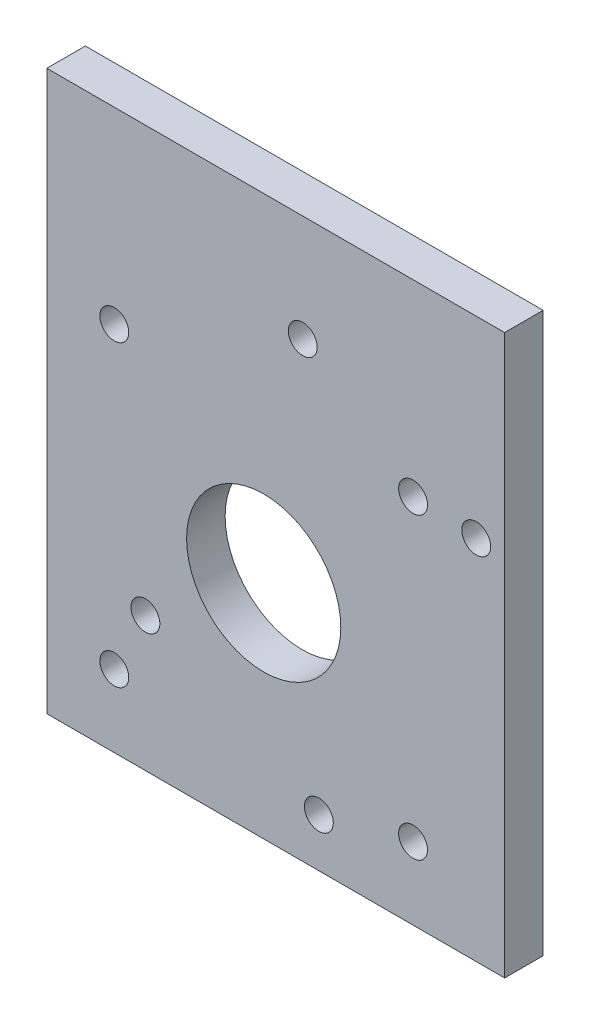
ISO-10303-21;
HEADER;
FILE_DESCRIPTION(('STEP AP214'),'2;1');
FILE_NAME('part.step','',(''),(''),'','','');
FILE_SCHEMA(('AUTOMOTIVE_DESIGN { 1 0 10303 214 1 1 1 1 }'));
ENDSEC;
DATA;
#1=APPLICATION_CONTEXT('core data for automotive mechanical design processes');
#2=APPLICATION_PROTOCOL_DEFINITION('international standard','automotive_design',2000,#1);
#3=PRODUCT_CONTEXT('',#1,'mechanical');
#4=PRODUCT('Part','Part','',(#3));
#5=PRODUCT_RELATED_PRODUCT_CATEGORY('part','',(#4));
#6=PRODUCT_DEFINITION_FORMATION('','',#4);
#7=PRODUCT_DEFINITION_CONTEXT('part definition',#1,'design');
#8=PRODUCT_DEFINITION('design','',#6,#7);
#9=PRODUCT_DEFINITION_SHAPE('','',#8);
#10=(LENGTH_UNIT() NAMED_UNIT(*) SI_UNIT(.MILLI.,.METRE.));
#11=(NAMED_UNIT(*) PLANE_ANGLE_UNIT() SI_UNIT($,.RADIAN.));
#12=(NAMED_UNIT(*) SI_UNIT($,.STERADIAN.) SOLID_ANGLE_UNIT());
#13=UNCERTAINTY_MEASURE_WITH_UNIT(LENGTH_MEASURE(1.E-05),#10,'distance_accuracy_value','');
#14=(GEOMETRIC_REPRESENTATION_CONTEXT(3) GLOBAL_UNCERTAINTY_ASSIGNED_CONTEXT((#13)) GLOBAL_UNIT_ASSIGNED_CONTEXT((#10,
#11,#12)) REPRESENTATION_CONTEXT('',''));
#15=CARTESIAN_POINT('',(0.,0.,0.));
#16=DIRECTION('',(0.,0.,1.));
#17=DIRECTION('',(1.,0.,0.));
#18=AXIS2_PLACEMENT_3D('',#15,#16,#17);
#19=CARTESIAN_POINT('',(-21.25,20.,2.));
#20=DIRECTION('',(1.,0.,0.));
#21=DIRECTION('',(0.,1.,0.));
#22=AXIS2_PLACEMENT_3D('',#19,#20,#21);
#23=PLANE('',#22);
#24=DIRECTION('',(0.,-1.,0.));
#25=VECTOR('',#24,1.);
#26=CARTESIAN_POINT('',(-21.25,20.,-2.));
#27=LINE('',#26,#25);
#28=CARTESIAN_POINT('',(-21.25,35.,-2.));
#29=VERTEX_POINT('',#28);
#30=CARTESIAN_POINT('',(-21.25,-23.,-2.));
#31=VERTEX_POINT('',#30);
#32=EDGE_CURVE('E48',#29,#31,#27,.T.);
#33=ORIENTED_EDGE('',*,*,#32,.T.);
#34=DIRECTION('',(0.,0.,-1.));
#35=VECTOR('',#34,1.);
#36=CARTESIAN_POINT('',(-21.25,-23.,2.));
#37=LINE('',#36,#35);
#38=CARTESIAN_POINT('',(-21.25,-23.,2.));
#39=VERTEX_POINT('',#38);
#40=EDGE_CURVE('E78',#39,#31,#37,.T.);
#41=ORIENTED_EDGE('',*,*,#40,.F.);
#42=DIRECTION('',(0.,-1.,0.));
#43=VECTOR('',#42,1.);
#44=CARTESIAN_POINT('',(-21.25,20.,2.));
#45=LINE('',#44,#43);
#46=CARTESIAN_POINT('',(-21.25,35.,2.));
#47=VERTEX_POINT('',#46);
#48=EDGE_CURVE('E11',#47,#39,#45,.T.);
#49=ORIENTED_EDGE('',*,*,#48,.F.);
#50=DIRECTION('',(0.,0.,1.));
#51=VECTOR('',#50,1.);
#52=CARTESIAN_POINT('',(-21.25,35.,-2.));
#53=LINE('',#52,#51);
#54=EDGE_CURVE('E80',#29,#47,#53,.T.);
#55=ORIENTED_EDGE('',*,*,#54,.F.);
#56=EDGE_LOOP('',(#33,#41,#49,#55));
#57=FACE_BOUND('',#56,.T.);
#58=ADVANCED_FACE('F39',(#57),#23,.F.);
#59=CARTESIAN_POINT('',(0.,0.,2.));
#60=DIRECTION('',(0.,0.,1.));
#61=DIRECTION('',(1.,0.,0.));
#62=AXIS2_PLACEMENT_3D('',#59,#60,#61);
#63=PLANE('',#62);
#64=CARTESIAN_POINT('',(5.30380298188453,23.9455011505475,2.));
#65=DIRECTION('',(0.,0.,1.));
#66=DIRECTION('',(1.,0.,0.));
#67=AXIS2_PLACEMENT_3D('',#64,#65,#66);
#68=CIRCLE('',#67,1.5);
#69=CARTESIAN_POINT('',(6.80380298188453,23.9455011505475,2.));
#70=VERTEX_POINT('',#69);
#71=EDGE_CURVE('E107',#70,#70,#68,.T.);
#72=ORIENTED_EDGE('',*,*,#71,.F.);
#73=EDGE_LOOP('',(#72));
#74=FACE_BOUND('',#73,.T.);
#75=CARTESIAN_POINT('',(23.3034781889665,15.0393082460977,2.));
#76=DIRECTION('',(0.,0.,1.));
#77=DIRECTION('',(1.,0.,0.));
#78=AXIS2_PLACEMENT_3D('',#75,#76,#77);
#79=CIRCLE('',#78,1.5);
#80=CARTESIAN_POINT('',(24.8034781889665,15.0393082460977,2.));
#81=VERTEX_POINT('',#80);
#82=EDGE_CURVE('E112',#81,#81,#79,.T.);
#83=ORIENTED_EDGE('',*,*,#82,.F.);
#84=EDGE_LOOP('',(#83));
#85=FACE_BOUND('',#84,.T.);
#86=CARTESIAN_POINT('',(6.97545786414189,-17.9600963002193,2.));
#87=DIRECTION('',(0.,0.,1.));
#88=DIRECTION('',(1.,0.,0.));
#89=AXIS2_PLACEMENT_3D('',#86,#87,#88);
#90=CIRCLE('',#89,1.5);
#91=CARTESIAN_POINT('',(8.47545786414189,-17.9600963002193,2.));
#92=VERTEX_POINT('',#91);
#93=EDGE_CURVE('E116',#92,#92,#90,.T.);
#94=ORIENTED_EDGE('',*,*,#93,.F.);
#95=EDGE_LOOP('',(#94));
#96=FACE_BOUND('',#95,.T.);
#97=CARTESIAN_POINT('',(-11.0242173429401,-9.05390339576949,2.));
#98=DIRECTION('',(0.,0.,1.));
#99=DIRECTION('',(1.,0.,0.));
#100=AXIS2_PLACEMENT_3D('',#97,#98,#99);
#101=CIRCLE('',#100,1.5);
#102=CARTESIAN_POINT('',(-9.52421734294013,-9.05390339576949,2.));
#103=VERTEX_POINT('',#102);
#104=EDGE_CURVE('E106',#103,#103,#101,.T.);
#105=ORIENTED_EDGE('',*,*,#104,.F.);
#106=EDGE_LOOP('',(#105));
#107=FACE_BOUND('',#106,.T.);
#108=CARTESIAN_POINT('',(1.25,0.,2.));
#109=DIRECTION('',(0.,0.,1.));
#110=DIRECTION('',(1.,0.,0.));
#111=AXIS2_PLACEMENT_3D('',#108,#109,#110);
#112=CIRCLE('',#111,8.);
#113=CARTESIAN_POINT('',(9.25,0.,2.));
#114=VERTEX_POINT('',#113);
#115=EDGE_CURVE('E140',#114,#114,#112,.T.);
#116=ORIENTED_EDGE('',*,*,#115,.F.);
#117=EDGE_LOOP('',(#116));
#118=FACE_BOUND('',#117,.T.);
#119=CARTESIAN_POINT('',(16.75,-15.5,2.));
#120=DIRECTION('',(0.,0.,-1.));
#121=DIRECTION('',(-1.,0.,0.));
#122=AXIS2_PLACEMENT_3D('',#119,#120,#121);
#123=CIRCLE('',#122,1.5);
#124=CARTESIAN_POINT('',(15.25,-15.5,2.));
#125=VERTEX_POINT('',#124);
#126=EDGE_CURVE('E166',#125,#125,#123,.T.);
#127=ORIENTED_EDGE('',*,*,#126,.T.);
#128=EDGE_LOOP('',(#127));
#129=FACE_BOUND('',#128,.T.);
#130=CARTESIAN_POINT('',(-14.25,-15.5,2.));
#131=DIRECTION('',(0.,0.,-1.));
#132=DIRECTION('',(-1.,0.,0.));
#133=AXIS2_PLACEMENT_3D('',#130,#131,#132);
#134=CIRCLE('',#133,1.5);
#135=CARTESIAN_POINT('',(-15.75,-15.5,2.));
#136=VERTEX_POINT('',#135);
#137=EDGE_CURVE('E158',#136,#136,#134,.T.);
#138=ORIENTED_EDGE('',*,*,#137,.T.);
#139=EDGE_LOOP('',(#138));
#140=FACE_BOUND('',#139,.T.);
#141=CARTESIAN_POINT('',(-14.25,15.5,2.));
#142=DIRECTION('',(0.,0.,-1.));
#143=DIRECTION('',(-1.,0.,0.));
#144=AXIS2_PLACEMENT_3D('',#141,#142,#143);
#145=CIRCLE('',#144,1.5);
#146=CARTESIAN_POINT('',(-15.75,15.5,2.));
#147=VERTEX_POINT('',#146);
#148=EDGE_CURVE('E149',#147,#147,#145,.T.);
#149=ORIENTED_EDGE('',*,*,#148,.T.);
#150=EDGE_LOOP('',(#149));
#151=FACE_BOUND('',#150,.T.);
#152=CARTESIAN_POINT('',(16.75,15.5,2.));
#153=DIRECTION('',(0.,0.,-1.));
#154=DIRECTION('',(-1.,0.,0.));
#155=AXIS2_PLACEMENT_3D('',#152,#153,#154);
#156=CIRCLE('',#155,1.5);
#157=CARTESIAN_POINT('',(15.25,15.5,2.));
#158=VERTEX_POINT('',#157);
#159=EDGE_CURVE('E82',#158,#158,#156,.T.);
#160=ORIENTED_EDGE('',*,*,#159,.T.);
#161=EDGE_LOOP('',(#160));
#162=FACE_BOUND('',#161,.T.);
#163=ORIENTED_EDGE('',*,*,#48,.T.);
#164=DIRECTION('',(-1.,0.,0.));
#165=VECTOR('',#164,1.);
#166=CARTESIAN_POINT('',(-21.25,-23.,2.));
#167=LINE('',#166,#165);
#168=CARTESIAN_POINT('',(26.25,-23.,2.));
#169=VERTEX_POINT('',#168);
#170=EDGE_CURVE('E98',#169,#39,#167,.T.);
#171=ORIENTED_EDGE('',*,*,#170,.F.);
#172=DIRECTION('',(0.,-1.,0.));
#173=VECTOR('',#172,1.);
#174=CARTESIAN_POINT('',(26.25,35.,2.));
#175=LINE('',#174,#173);
#176=CARTESIAN_POINT('',(26.25,35.,2.));
#177=VERTEX_POINT('',#176);
#178=EDGE_CURVE('E123',#177,#169,#175,.T.);
#179=ORIENTED_EDGE('',*,*,#178,.F.);
#180=DIRECTION('',(1.,0.,0.));
#181=VECTOR('',#180,1.);
#182=CARTESIAN_POINT('',(-21.25,35.,2.));
#183=LINE('',#182,#181);
#184=EDGE_CURVE('E134',#47,#177,#183,.T.);
#185=ORIENTED_EDGE('',*,*,#184,.F.);
#186=EDGE_LOOP('',(#163,#171,#179,#185));
#187=FACE_BOUND('',#186,.T.);
#188=ADVANCED_FACE('F209',(#74,#85,#96,#107,#118,#129,#140,#151,#162,#187),#63,.T.);
#189=CARTESIAN_POINT('',(0.,0.,-2.));
#190=DIRECTION('',(0.,0.,1.));
#191=DIRECTION('',(1.,0.,0.));
#192=AXIS2_PLACEMENT_3D('',#189,#190,#191);
#193=PLANE('',#192);
#194=CARTESIAN_POINT('',(5.30380298188453,23.9455011505475,-2.));
#195=DIRECTION('',(0.,0.,1.));
#196=DIRECTION('',(1.,0.,0.));
#197=AXIS2_PLACEMENT_3D('',#194,#195,#196);
#198=CIRCLE('',#197,1.5);
#199=CARTESIAN_POINT('',(6.80380298188453,23.9455011505475,-2.));
#200=VERTEX_POINT('',#199);
#201=EDGE_CURVE('E42',#200,#200,#198,.T.);
#202=ORIENTED_EDGE('',*,*,#201,.T.);
#203=EDGE_LOOP('',(#202));
#204=FACE_BOUND('',#203,.T.);
#205=CARTESIAN_POINT('',(23.3034781889665,15.0393082460977,-2.));
#206=DIRECTION('',(0.,0.,1.));
#207=DIRECTION('',(1.,0.,0.));
#208=AXIS2_PLACEMENT_3D('',#205,#206,#207);
#209=CIRCLE('',#208,1.5);
#210=CARTESIAN_POINT('',(24.8034781889665,15.0393082460977,-2.));
#211=VERTEX_POINT('',#210);
#212=EDGE_CURVE('E185',#211,#211,#209,.T.);
#213=ORIENTED_EDGE('',*,*,#212,.T.);
#214=EDGE_LOOP('',(#213));
#215=FACE_BOUND('',#214,.T.);
#216=CARTESIAN_POINT('',(6.97545786414189,-17.9600963002193,-2.));
#217=DIRECTION('',(0.,0.,1.));
#218=DIRECTION('',(1.,0.,0.));
#219=AXIS2_PLACEMENT_3D('',#216,#217,#218);
#220=CIRCLE('',#219,1.5);
#221=CARTESIAN_POINT('',(8.47545786414189,-17.9600963002193,-2.));
#222=VERTEX_POINT('',#221);
#223=EDGE_CURVE('E182',#222,#222,#220,.T.);
#224=ORIENTED_EDGE('',*,*,#223,.T.);
#225=EDGE_LOOP('',(#224));
#226=FACE_BOUND('',#225,.T.);
#227=CARTESIAN_POINT('',(-11.0242173429401,-9.05390339576949,-2.));
#228=DIRECTION('',(0.,0.,1.));
#229=DIRECTION('',(1.,0.,0.));
#230=AXIS2_PLACEMENT_3D('',#227,#228,#229);
#231=CIRCLE('',#230,1.5);
#232=CARTESIAN_POINT('',(-9.52421734294013,-9.05390339576949,-2.));
#233=VERTEX_POINT('',#232);
#234=EDGE_CURVE('E111',#233,#233,#231,.T.);
#235=ORIENTED_EDGE('',*,*,#234,.T.);
#236=EDGE_LOOP('',(#235));
#237=FACE_BOUND('',#236,.T.);
#238=CARTESIAN_POINT('',(1.25,0.,-2.));
#239=DIRECTION('',(0.,0.,1.));
#240=DIRECTION('',(1.,0.,0.));
#241=AXIS2_PLACEMENT_3D('',#238,#239,#240);
#242=CIRCLE('',#241,8.);
#243=CARTESIAN_POINT('',(9.25,0.,-2.));
#244=VERTEX_POINT('',#243);
#245=EDGE_CURVE('E141',#244,#244,#242,.T.);
#246=ORIENTED_EDGE('',*,*,#245,.T.);
#247=EDGE_LOOP('',(#246));
#248=FACE_BOUND('',#247,.T.);
#249=CARTESIAN_POINT('',(16.75,-15.5,-2.));
#250=DIRECTION('',(0.,0.,-1.));
#251=DIRECTION('',(-1.,0.,0.));
#252=AXIS2_PLACEMENT_3D('',#249,#250,#251);
#253=CIRCLE('',#252,1.5);
#254=CARTESIAN_POINT('',(15.25,-15.5,-2.));
#255=VERTEX_POINT('',#254);
#256=EDGE_CURVE('E145',#255,#255,#253,.T.);
#257=ORIENTED_EDGE('',*,*,#256,.F.);
#258=EDGE_LOOP('',(#257));
#259=FACE_BOUND('',#258,.T.);
#260=CARTESIAN_POINT('',(-14.25,-15.5,-2.));
#261=DIRECTION('',(0.,0.,-1.));
#262=DIRECTION('',(-1.,0.,0.));
#263=AXIS2_PLACEMENT_3D('',#260,#261,#262);
#264=CIRCLE('',#263,1.5);
#265=CARTESIAN_POINT('',(-15.75,-15.5,-2.));
#266=VERTEX_POINT('',#265);
#267=EDGE_CURVE('E162',#266,#266,#264,.T.);
#268=ORIENTED_EDGE('',*,*,#267,.F.);
#269=EDGE_LOOP('',(#268));
#270=FACE_BOUND('',#269,.T.);
#271=CARTESIAN_POINT('',(-14.25,15.5,-2.));
#272=DIRECTION('',(0.,0.,-1.));
#273=DIRECTION('',(-1.,0.,0.));
#274=AXIS2_PLACEMENT_3D('',#271,#272,#273);
#275=CIRCLE('',#274,1.5);
#276=CARTESIAN_POINT('',(-15.75,15.5,-2.));
#277=VERTEX_POINT('',#276);
#278=EDGE_CURVE('E154',#277,#277,#275,.T.);
#279=ORIENTED_EDGE('',*,*,#278,.F.);
#280=EDGE_LOOP('',(#279));
#281=FACE_BOUND('',#280,.T.);
#282=CARTESIAN_POINT('',(16.75,15.5,-2.));
#283=DIRECTION('',(0.,0.,-1.));
#284=DIRECTION('',(-1.,0.,0.));
#285=AXIS2_PLACEMENT_3D('',#282,#283,#284);
#286=CIRCLE('',#285,1.5);
#287=CARTESIAN_POINT('',(15.25,15.5,-2.));
#288=VERTEX_POINT('',#287);
#289=EDGE_CURVE('E153',#288,#288,#286,.T.);
#290=ORIENTED_EDGE('',*,*,#289,.F.);
#291=EDGE_LOOP('',(#290));
#292=FACE_BOUND('',#291,.T.);
#293=DIRECTION('',(-1.,0.,0.));
#294=VECTOR('',#293,1.);
#295=CARTESIAN_POINT('',(-21.25,35.,-2.));
#296=LINE('',#295,#294);
#297=CARTESIAN_POINT('',(26.25,35.,-2.));
#298=VERTEX_POINT('',#297);
#299=EDGE_CURVE('E137',#298,#29,#296,.T.);
#300=ORIENTED_EDGE('',*,*,#299,.F.);
#301=DIRECTION('',(0.,1.,0.));
#302=VECTOR('',#301,1.);
#303=CARTESIAN_POINT('',(26.25,35.,-2.));
#304=LINE('',#303,#302);
#305=CARTESIAN_POINT('',(26.25,-23.,-2.));
#306=VERTEX_POINT('',#305);
#307=EDGE_CURVE('E88',#306,#298,#304,.T.);
#308=ORIENTED_EDGE('',*,*,#307,.F.);
#309=DIRECTION('',(1.,0.,0.));
#310=VECTOR('',#309,1.);
#311=CARTESIAN_POINT('',(-21.25,-23.,-2.));
#312=LINE('',#311,#310);
#313=EDGE_CURVE('E85',#31,#306,#312,.T.);
#314=ORIENTED_EDGE('',*,*,#313,.F.);
#315=ORIENTED_EDGE('',*,*,#32,.F.);
#316=EDGE_LOOP('',(#300,#308,#314,#315));
#317=FACE_BOUND('',#316,.T.);
#318=ADVANCED_FACE('F86',(#204,#215,#226,#237,#248,#259,#270,#281,#292,#317),#193,.F.);
#319=CARTESIAN_POINT('',(16.75,15.5,2.));
#320=DIRECTION('',(0.,0.,-1.));
#321=DIRECTION('',(-1.,0.,0.));
#322=AXIS2_PLACEMENT_3D('',#319,#320,#321);
#323=CYLINDRICAL_SURFACE('',#322,1.5);
#324=ORIENTED_EDGE('',*,*,#159,.F.);
#325=EDGE_LOOP('',(#324));
#326=FACE_BOUND('',#325,.T.);
#327=ORIENTED_EDGE('',*,*,#289,.T.);
#328=EDGE_LOOP('',(#327));
#329=FACE_BOUND('',#328,.T.);
#330=ADVANCED_FACE('F218',(#326,#329),#323,.F.);
#331=CARTESIAN_POINT('',(-14.25,15.5,2.));
#332=DIRECTION('',(0.,0.,-1.));
#333=DIRECTION('',(-1.,0.,0.));
#334=AXIS2_PLACEMENT_3D('',#331,#332,#333);
#335=CYLINDRICAL_SURFACE('',#334,1.5);
#336=ORIENTED_EDGE('',*,*,#148,.F.);
#337=EDGE_LOOP('',(#336));
#338=FACE_BOUND('',#337,.T.);
#339=ORIENTED_EDGE('',*,*,#278,.T.);
#340=EDGE_LOOP('',(#339));
#341=FACE_BOUND('',#340,.T.);
#342=ADVANCED_FACE('F224',(#338,#341),#335,.F.);
#343=CARTESIAN_POINT('',(-14.25,-15.5,2.));
#344=DIRECTION('',(0.,0.,-1.));
#345=DIRECTION('',(-1.,0.,0.));
#346=AXIS2_PLACEMENT_3D('',#343,#344,#345);
#347=CYLINDRICAL_SURFACE('',#346,1.5);
#348=ORIENTED_EDGE('',*,*,#137,.F.);
#349=EDGE_LOOP('',(#348));
#350=FACE_BOUND('',#349,.T.);
#351=ORIENTED_EDGE('',*,*,#267,.T.);
#352=EDGE_LOOP('',(#351));
#353=FACE_BOUND('',#352,.T.);
#354=ADVANCED_FACE('F230',(#350,#353),#347,.F.);
#355=CARTESIAN_POINT('',(16.75,-15.5,2.));
#356=DIRECTION('',(0.,0.,-1.));
#357=DIRECTION('',(-1.,0.,0.));
#358=AXIS2_PLACEMENT_3D('',#355,#356,#357);
#359=CYLINDRICAL_SURFACE('',#358,1.5);
#360=ORIENTED_EDGE('',*,*,#126,.F.);
#361=EDGE_LOOP('',(#360));
#362=FACE_BOUND('',#361,.T.);
#363=ORIENTED_EDGE('',*,*,#256,.T.);
#364=EDGE_LOOP('',(#363));
#365=FACE_BOUND('',#364,.T.);
#366=ADVANCED_FACE('F226',(#362,#365),#359,.F.);
#367=CARTESIAN_POINT('',(1.25,0.,-2.));
#368=DIRECTION('',(0.,0.,1.));
#369=DIRECTION('',(1.,0.,0.));
#370=AXIS2_PLACEMENT_3D('',#367,#368,#369);
#371=CYLINDRICAL_SURFACE('',#370,8.);
#372=ORIENTED_EDGE('',*,*,#245,.F.);
#373=EDGE_LOOP('',(#372));
#374=FACE_BOUND('',#373,.T.);
#375=ORIENTED_EDGE('',*,*,#115,.T.);
#376=EDGE_LOOP('',(#375));
#377=FACE_BOUND('',#376,.T.);
#378=ADVANCED_FACE('F229',(#374,#377),#371,.F.);
#379=CARTESIAN_POINT('',(0.,35.,0.));
#380=DIRECTION('',(0.,1.,0.));
#381=DIRECTION('',(0.,0.,1.));
#382=AXIS2_PLACEMENT_3D('',#379,#380,#381);
#383=PLANE('',#382);
#384=ORIENTED_EDGE('',*,*,#54,.T.);
#385=ORIENTED_EDGE('',*,*,#184,.T.);
#386=DIRECTION('',(0.,0.,1.));
#387=VECTOR('',#386,1.);
#388=CARTESIAN_POINT('',(26.25,35.,2.));
#389=LINE('',#388,#387);
#390=EDGE_CURVE('E128',#298,#177,#389,.T.);
#391=ORIENTED_EDGE('',*,*,#390,.F.);
#392=ORIENTED_EDGE('',*,*,#299,.T.);
#393=EDGE_LOOP('',(#384,#385,#391,#392));
#394=FACE_BOUND('',#393,.T.);
#395=ADVANCED_FACE('F240',(#394),#383,.T.);
#396=CARTESIAN_POINT('',(26.25,0.,0.));
#397=DIRECTION('',(1.,0.,0.));
#398=DIRECTION('',(0.,0.,-1.));
#399=AXIS2_PLACEMENT_3D('',#396,#397,#398);
#400=PLANE('',#399);
#401=ORIENTED_EDGE('',*,*,#178,.T.);
#402=DIRECTION('',(0.,0.,1.));
#403=VECTOR('',#402,1.);
#404=CARTESIAN_POINT('',(26.25,-23.,2.));
#405=LINE('',#404,#403);
#406=EDGE_CURVE('E93',#306,#169,#405,.T.);
#407=ORIENTED_EDGE('',*,*,#406,.F.);
#408=ORIENTED_EDGE('',*,*,#307,.T.);
#409=ORIENTED_EDGE('',*,*,#390,.T.);
#410=EDGE_LOOP('',(#401,#407,#408,#409));
#411=FACE_BOUND('',#410,.T.);
#412=ADVANCED_FACE('F244',(#411),#400,.T.);
#413=CARTESIAN_POINT('',(-11.0242173429401,-9.05390339576949,-8.));
#414=DIRECTION('',(0.,0.,1.));
#415=DIRECTION('',(1.,0.,0.));
#416=AXIS2_PLACEMENT_3D('',#413,#414,#415);
#417=CYLINDRICAL_SURFACE('',#416,1.5);
#418=ORIENTED_EDGE('',*,*,#104,.T.);
#419=EDGE_LOOP('',(#418));
#420=FACE_BOUND('',#419,.T.);
#421=ORIENTED_EDGE('',*,*,#234,.F.);
#422=EDGE_LOOP('',(#421));
#423=FACE_BOUND('',#422,.T.);
#424=ADVANCED_FACE('F248',(#420,#423),#417,.F.);
#425=CARTESIAN_POINT('',(6.97545786414189,-17.9600963002193,-8.));
#426=DIRECTION('',(0.,0.,1.));
#427=DIRECTION('',(1.,0.,0.));
#428=AXIS2_PLACEMENT_3D('',#425,#426,#427);
#429=CYLINDRICAL_SURFACE('',#428,1.5);
#430=ORIENTED_EDGE('',*,*,#93,.T.);
#431=EDGE_LOOP('',(#430));
#432=FACE_BOUND('',#431,.T.);
#433=ORIENTED_EDGE('',*,*,#223,.F.);
#434=EDGE_LOOP('',(#433));
#435=FACE_BOUND('',#434,.T.);
#436=ADVANCED_FACE('F205',(#432,#435),#429,.F.);
#437=CARTESIAN_POINT('',(23.3034781889665,15.0393082460977,-8.));
#438=DIRECTION('',(0.,0.,1.));
#439=DIRECTION('',(1.,0.,0.));
#440=AXIS2_PLACEMENT_3D('',#437,#438,#439);
#441=CYLINDRICAL_SURFACE('',#440,1.5);
#442=ORIENTED_EDGE('',*,*,#82,.T.);
#443=EDGE_LOOP('',(#442));
#444=FACE_BOUND('',#443,.T.);
#445=ORIENTED_EDGE('',*,*,#212,.F.);
#446=EDGE_LOOP('',(#445));
#447=FACE_BOUND('',#446,.T.);
#448=ADVANCED_FACE('F197',(#444,#447),#441,.F.);
#449=CARTESIAN_POINT('',(5.30380298188453,23.9455011505475,-8.));
#450=DIRECTION('',(0.,0.,1.));
#451=DIRECTION('',(1.,0.,0.));
#452=AXIS2_PLACEMENT_3D('',#449,#450,#451);
#453=CYLINDRICAL_SURFACE('',#452,1.5);
#454=ORIENTED_EDGE('',*,*,#71,.T.);
#455=EDGE_LOOP('',(#454));
#456=FACE_BOUND('',#455,.T.);
#457=ORIENTED_EDGE('',*,*,#201,.F.);
#458=EDGE_LOOP('',(#457));
#459=FACE_BOUND('',#458,.T.);
#460=ADVANCED_FACE('F195',(#456,#459),#453,.F.);
#461=CARTESIAN_POINT('',(0.,-23.,0.));
#462=DIRECTION('',(0.,-1.,0.));
#463=DIRECTION('',(0.,0.,-1.));
#464=AXIS2_PLACEMENT_3D('',#461,#462,#463);
#465=PLANE('',#464);
#466=ORIENTED_EDGE('',*,*,#40,.T.);
#467=ORIENTED_EDGE('',*,*,#313,.T.);
#468=ORIENTED_EDGE('',*,*,#406,.T.);
#469=ORIENTED_EDGE('',*,*,#170,.T.);
#470=EDGE_LOOP('',(#466,#467,#468,#469));
#471=FACE_BOUND('',#470,.T.);
#472=ADVANCED_FACE('F96',(#471),#465,.T.);
#473=CLOSED_SHELL('',(#58,#188,#318,#330,#342,#354,#366,#378,#395,#412,#424,#436,#448,#460,#472));
#474=MANIFOLD_SOLID_BREP('B2',#473);
#475=ADVANCED_BREP_SHAPE_REPRESENTATION('',(#18,#474),#14);
#476=SHAPE_DEFINITION_REPRESENTATION(#9,#475);
ENDSEC;
END-ISO-10303-21;
